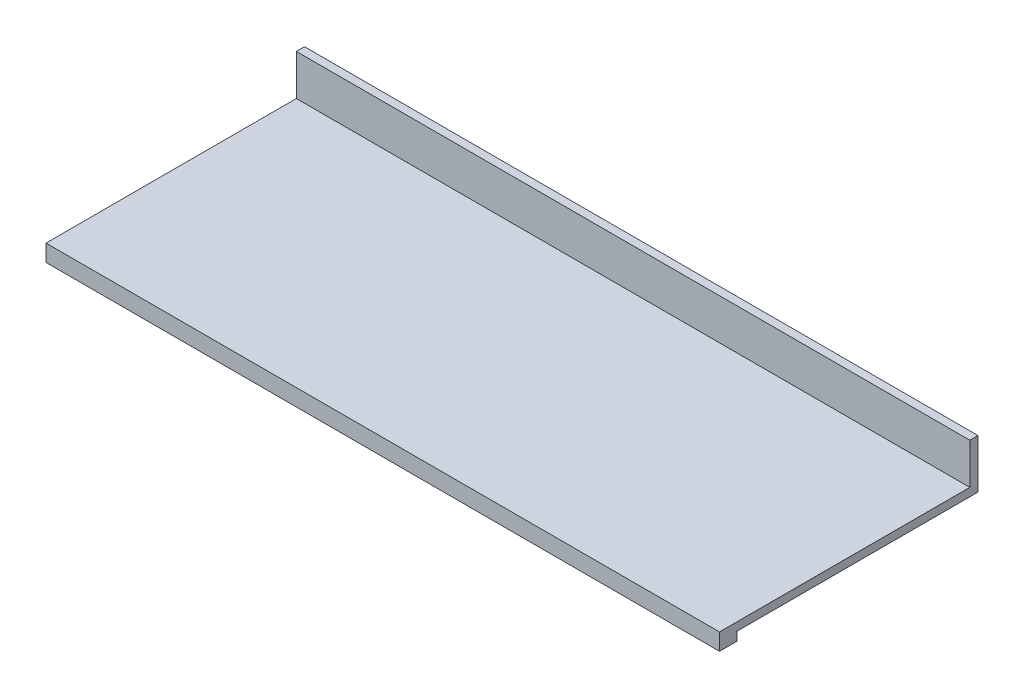
ISO-10303-21;
HEADER;
FILE_DESCRIPTION(('STEP AP214'),'2;1');
FILE_NAME('part.step','',(''),(''),'','','');
FILE_SCHEMA(('AUTOMOTIVE_DESIGN { 1 0 10303 214 1 1 1 1 }'));
ENDSEC;
DATA;
#1=APPLICATION_CONTEXT('core data for automotive mechanical design processes');
#2=APPLICATION_PROTOCOL_DEFINITION('international standard','automotive_design',2000,#1);
#3=PRODUCT_CONTEXT('',#1,'mechanical');
#4=PRODUCT('Part','Part','',(#3));
#5=PRODUCT_RELATED_PRODUCT_CATEGORY('part','',(#4));
#6=PRODUCT_DEFINITION_FORMATION('','',#4);
#7=PRODUCT_DEFINITION_CONTEXT('part definition',#1,'design');
#8=PRODUCT_DEFINITION('design','',#6,#7);
#9=PRODUCT_DEFINITION_SHAPE('','',#8);
#10=(LENGTH_UNIT() NAMED_UNIT(*) SI_UNIT(.MILLI.,.METRE.));
#11=(NAMED_UNIT(*) PLANE_ANGLE_UNIT() SI_UNIT($,.RADIAN.));
#12=(NAMED_UNIT(*) SI_UNIT($,.STERADIAN.) SOLID_ANGLE_UNIT());
#13=UNCERTAINTY_MEASURE_WITH_UNIT(LENGTH_MEASURE(1.E-05),#10,'distance_accuracy_value','');
#14=(GEOMETRIC_REPRESENTATION_CONTEXT(3) GLOBAL_UNCERTAINTY_ASSIGNED_CONTEXT((#13)) GLOBAL_UNIT_ASSIGNED_CONTEXT((#10,
#11,#12)) REPRESENTATION_CONTEXT('',''));
#15=CARTESIAN_POINT('',(0.,0.,0.));
#16=DIRECTION('',(0.,0.,1.));
#17=DIRECTION('',(1.,0.,0.));
#18=AXIS2_PLACEMENT_3D('',#15,#16,#17);
#19=CARTESIAN_POINT('',(0.,12.,0.));
#20=DIRECTION('',(0.,-1.,0.));
#21=DIRECTION('',(0.,0.,-1.));
#22=AXIS2_PLACEMENT_3D('',#19,#20,#21);
#23=PLANE('',#22);
#24=DIRECTION('',(1.,0.,0.));
#25=VECTOR('',#24,1.);
#26=CARTESIAN_POINT('',(495.,12.,-178.));
#27=LINE('',#26,#25);
#28=CARTESIAN_POINT('',(-495.,12.,-178.));
#29=VERTEX_POINT('',#28);
#30=CARTESIAN_POINT('',(495.,12.,-178.));
#31=VERTEX_POINT('',#30);
#32=EDGE_CURVE('E49',#29,#31,#27,.T.);
#33=ORIENTED_EDGE('',*,*,#32,.F.);
#34=DIRECTION('',(0.,0.,1.));
#35=VECTOR('',#34,1.);
#36=CARTESIAN_POINT('',(-495.,12.,190.));
#37=LINE('',#36,#35);
#38=CARTESIAN_POINT('',(-495.,12.,190.));
#39=VERTEX_POINT('',#38);
#40=EDGE_CURVE('E148',#29,#39,#37,.T.);
#41=ORIENTED_EDGE('',*,*,#40,.T.);
#42=DIRECTION('',(1.,0.,0.));
#43=VECTOR('',#42,1.);
#44=CARTESIAN_POINT('',(-495.,12.,190.));
#45=LINE('',#44,#43);
#46=CARTESIAN_POINT('',(495.,12.,190.));
#47=VERTEX_POINT('',#46);
#48=EDGE_CURVE('E151',#39,#47,#45,.T.);
#49=ORIENTED_EDGE('',*,*,#48,.T.);
#50=DIRECTION('',(0.,0.,-1.));
#51=VECTOR('',#50,1.);
#52=CARTESIAN_POINT('',(495.,12.,190.));
#53=LINE('',#52,#51);
#54=EDGE_CURVE('E146',#47,#31,#53,.T.);
#55=ORIENTED_EDGE('',*,*,#54,.T.);
#56=EDGE_LOOP('',(#33,#41,#49,#55));
#57=FACE_BOUND('',#56,.T.);
#58=ADVANCED_FACE('F34',(#57),#23,.F.);
#59=CARTESIAN_POINT('',(495.,12.,190.));
#60=DIRECTION('',(-1.,0.,0.));
#61=DIRECTION('',(0.,0.,1.));
#62=AXIS2_PLACEMENT_3D('',#59,#60,#61);
#63=PLANE('',#62);
#64=DIRECTION('',(0.,-1.,0.));
#65=VECTOR('',#64,1.);
#66=CARTESIAN_POINT('',(495.,12.,190.));
#67=LINE('',#66,#65);
#68=CARTESIAN_POINT('',(495.,-12.7,190.));
#69=VERTEX_POINT('',#68);
#70=EDGE_CURVE('E153',#47,#69,#67,.T.);
#71=ORIENTED_EDGE('',*,*,#70,.T.);
#72=DIRECTION('',(0.,0.,1.));
#73=VECTOR('',#72,1.);
#74=CARTESIAN_POINT('',(495.,-12.7,190.));
#75=LINE('',#74,#73);
#76=CARTESIAN_POINT('',(495.,-12.7,164.6));
#77=VERTEX_POINT('',#76);
#78=EDGE_CURVE('E134',#77,#69,#75,.T.);
#79=ORIENTED_EDGE('',*,*,#78,.F.);
#80=DIRECTION('',(0.,1.,0.));
#81=VECTOR('',#80,1.);
#82=CARTESIAN_POINT('',(495.,-12.7,164.6));
#83=LINE('',#82,#81);
#84=CARTESIAN_POINT('',(495.,0.,164.6));
#85=VERTEX_POINT('',#84);
#86=EDGE_CURVE('E140',#77,#85,#83,.T.);
#87=ORIENTED_EDGE('',*,*,#86,.T.);
#88=DIRECTION('',(0.,0.,-1.));
#89=VECTOR('',#88,1.);
#90=CARTESIAN_POINT('',(495.,0.,190.));
#91=LINE('',#90,#89);
#92=CARTESIAN_POINT('',(495.,0.,-190.));
#93=VERTEX_POINT('',#92);
#94=EDGE_CURVE('E104',#85,#93,#91,.T.);
#95=ORIENTED_EDGE('',*,*,#94,.T.);
#96=DIRECTION('',(0.,-1.,0.));
#97=VECTOR('',#96,1.);
#98=CARTESIAN_POINT('',(495.,12.,-190.));
#99=LINE('',#98,#97);
#100=CARTESIAN_POINT('',(495.,72.,-190.));
#101=VERTEX_POINT('',#100);
#102=EDGE_CURVE('E11',#101,#93,#99,.T.);
#103=ORIENTED_EDGE('',*,*,#102,.F.);
#104=DIRECTION('',(0.,0.,-1.));
#105=VECTOR('',#104,1.);
#106=CARTESIAN_POINT('',(495.,72.,-190.));
#107=LINE('',#106,#105);
#108=CARTESIAN_POINT('',(495.,72.,-178.));
#109=VERTEX_POINT('',#108);
#110=EDGE_CURVE('E102',#109,#101,#107,.T.);
#111=ORIENTED_EDGE('',*,*,#110,.F.);
#112=DIRECTION('',(0.,-1.,0.));
#113=VECTOR('',#112,1.);
#114=CARTESIAN_POINT('',(495.,72.,-178.));
#115=LINE('',#114,#113);
#116=EDGE_CURVE('E123',#109,#31,#115,.T.);
#117=ORIENTED_EDGE('',*,*,#116,.T.);
#118=ORIENTED_EDGE('',*,*,#54,.F.);
#119=EDGE_LOOP('',(#71,#79,#87,#95,#103,#111,#117,#118));
#120=FACE_BOUND('',#119,.T.);
#121=ADVANCED_FACE('F36',(#120),#63,.F.);
#122=CARTESIAN_POINT('',(-495.,12.,-190.));
#123=DIRECTION('',(0.,0.,1.));
#124=DIRECTION('',(1.,0.,0.));
#125=AXIS2_PLACEMENT_3D('',#122,#123,#124);
#126=PLANE('',#125);
#127=DIRECTION('',(-1.,0.,0.));
#128=VECTOR('',#127,1.);
#129=CARTESIAN_POINT('',(-495.,0.,-190.));
#130=LINE('',#129,#128);
#131=CARTESIAN_POINT('',(-495.,0.,-190.));
#132=VERTEX_POINT('',#131);
#133=EDGE_CURVE('E155',#93,#132,#130,.T.);
#134=ORIENTED_EDGE('',*,*,#133,.T.);
#135=DIRECTION('',(0.,-1.,0.));
#136=VECTOR('',#135,1.);
#137=CARTESIAN_POINT('',(-495.,12.,-190.));
#138=LINE('',#137,#136);
#139=CARTESIAN_POINT('',(-495.,72.,-190.));
#140=VERTEX_POINT('',#139);
#141=EDGE_CURVE('E42',#140,#132,#138,.T.);
#142=ORIENTED_EDGE('',*,*,#141,.F.);
#143=DIRECTION('',(-1.,0.,0.));
#144=VECTOR('',#143,1.);
#145=CARTESIAN_POINT('',(495.,72.,-190.));
#146=LINE('',#145,#144);
#147=EDGE_CURVE('E108',#101,#140,#146,.T.);
#148=ORIENTED_EDGE('',*,*,#147,.F.);
#149=ORIENTED_EDGE('',*,*,#102,.T.);
#150=EDGE_LOOP('',(#134,#142,#148,#149));
#151=FACE_BOUND('',#150,.T.);
#152=ADVANCED_FACE('F109',(#151),#126,.F.);
#153=CARTESIAN_POINT('',(-495.,12.,190.));
#154=DIRECTION('',(1.,0.,0.));
#155=DIRECTION('',(0.,0.,-1.));
#156=AXIS2_PLACEMENT_3D('',#153,#154,#155);
#157=PLANE('',#156);
#158=DIRECTION('',(0.,0.,1.));
#159=VECTOR('',#158,1.);
#160=CARTESIAN_POINT('',(-495.,0.,190.));
#161=LINE('',#160,#159);
#162=CARTESIAN_POINT('',(-495.,0.,164.6));
#163=VERTEX_POINT('',#162);
#164=EDGE_CURVE('E149',#132,#163,#161,.T.);
#165=ORIENTED_EDGE('',*,*,#164,.T.);
#166=DIRECTION('',(0.,1.,0.));
#167=VECTOR('',#166,1.);
#168=CARTESIAN_POINT('',(-495.,-12.7,164.6));
#169=LINE('',#168,#167);
#170=CARTESIAN_POINT('',(-495.,-12.7,164.6));
#171=VERTEX_POINT('',#170);
#172=EDGE_CURVE('E143',#171,#163,#169,.T.);
#173=ORIENTED_EDGE('',*,*,#172,.F.);
#174=DIRECTION('',(0.,0.,-1.));
#175=VECTOR('',#174,1.);
#176=CARTESIAN_POINT('',(-495.,-12.7,190.));
#177=LINE('',#176,#175);
#178=CARTESIAN_POINT('',(-495.,-12.7,190.));
#179=VERTEX_POINT('',#178);
#180=EDGE_CURVE('E129',#179,#171,#177,.T.);
#181=ORIENTED_EDGE('',*,*,#180,.F.);
#182=DIRECTION('',(0.,-1.,0.));
#183=VECTOR('',#182,1.);
#184=CARTESIAN_POINT('',(-495.,12.,190.));
#185=LINE('',#184,#183);
#186=EDGE_CURVE('E159',#39,#179,#185,.T.);
#187=ORIENTED_EDGE('',*,*,#186,.F.);
#188=ORIENTED_EDGE('',*,*,#40,.F.);
#189=DIRECTION('',(0.,-1.,0.));
#190=VECTOR('',#189,1.);
#191=CARTESIAN_POINT('',(-495.,72.,-178.));
#192=LINE('',#191,#190);
#193=CARTESIAN_POINT('',(-495.,72.,-178.));
#194=VERTEX_POINT('',#193);
#195=EDGE_CURVE('E126',#194,#29,#192,.T.);
#196=ORIENTED_EDGE('',*,*,#195,.F.);
#197=DIRECTION('',(0.,0.,1.));
#198=VECTOR('',#197,1.);
#199=CARTESIAN_POINT('',(-495.,72.,-190.));
#200=LINE('',#199,#198);
#201=EDGE_CURVE('E113',#140,#194,#200,.T.);
#202=ORIENTED_EDGE('',*,*,#201,.F.);
#203=ORIENTED_EDGE('',*,*,#141,.T.);
#204=EDGE_LOOP('',(#165,#173,#181,#187,#188,#196,#202,#203));
#205=FACE_BOUND('',#204,.T.);
#206=ADVANCED_FACE('F161',(#205),#157,.F.);
#207=CARTESIAN_POINT('',(-495.,12.,190.));
#208=DIRECTION('',(0.,0.,-1.));
#209=DIRECTION('',(-1.,0.,0.));
#210=AXIS2_PLACEMENT_3D('',#207,#208,#209);
#211=PLANE('',#210);
#212=ORIENTED_EDGE('',*,*,#186,.T.);
#213=DIRECTION('',(-1.,0.,0.));
#214=VECTOR('',#213,1.);
#215=CARTESIAN_POINT('',(-495.,-12.7,190.));
#216=LINE('',#215,#214);
#217=EDGE_CURVE('E137',#69,#179,#216,.T.);
#218=ORIENTED_EDGE('',*,*,#217,.F.);
#219=ORIENTED_EDGE('',*,*,#70,.F.);
#220=ORIENTED_EDGE('',*,*,#48,.F.);
#221=EDGE_LOOP('',(#212,#218,#219,#220));
#222=FACE_BOUND('',#221,.T.);
#223=ADVANCED_FACE('F176',(#222),#211,.F.);
#224=CARTESIAN_POINT('',(0.,0.,0.));
#225=DIRECTION('',(0.,-1.,0.));
#226=DIRECTION('',(0.,0.,-1.));
#227=AXIS2_PLACEMENT_3D('',#224,#225,#226);
#228=PLANE('',#227);
#229=DIRECTION('',(1.,0.,0.));
#230=VECTOR('',#229,1.);
#231=CARTESIAN_POINT('',(-495.,0.,164.6));
#232=LINE('',#231,#230);
#233=EDGE_CURVE('E57',#163,#85,#232,.T.);
#234=ORIENTED_EDGE('',*,*,#233,.F.);
#235=ORIENTED_EDGE('',*,*,#164,.F.);
#236=ORIENTED_EDGE('',*,*,#133,.F.);
#237=ORIENTED_EDGE('',*,*,#94,.F.);
#238=EDGE_LOOP('',(#234,#235,#236,#237));
#239=FACE_BOUND('',#238,.T.);
#240=ADVANCED_FACE('F164',(#239),#228,.T.);
#241=CARTESIAN_POINT('',(-495.,-12.7,164.6));
#242=DIRECTION('',(0.,0.,1.));
#243=DIRECTION('',(1.,0.,0.));
#244=AXIS2_PLACEMENT_3D('',#241,#242,#243);
#245=PLANE('',#244);
#246=ORIENTED_EDGE('',*,*,#233,.T.);
#247=ORIENTED_EDGE('',*,*,#86,.F.);
#248=DIRECTION('',(1.,0.,0.));
#249=VECTOR('',#248,1.);
#250=CARTESIAN_POINT('',(-495.,-12.7,164.6));
#251=LINE('',#250,#249);
#252=EDGE_CURVE('E132',#171,#77,#251,.T.);
#253=ORIENTED_EDGE('',*,*,#252,.F.);
#254=ORIENTED_EDGE('',*,*,#172,.T.);
#255=EDGE_LOOP('',(#246,#247,#253,#254));
#256=FACE_BOUND('',#255,.T.);
#257=ADVANCED_FACE('F167',(#256),#245,.F.);
#258=CARTESIAN_POINT('',(0.,-12.7,0.));
#259=DIRECTION('',(0.,-1.,0.));
#260=DIRECTION('',(0.,0.,-1.));
#261=AXIS2_PLACEMENT_3D('',#258,#259,#260);
#262=PLANE('',#261);
#263=ORIENTED_EDGE('',*,*,#180,.T.);
#264=ORIENTED_EDGE('',*,*,#252,.T.);
#265=ORIENTED_EDGE('',*,*,#78,.T.);
#266=ORIENTED_EDGE('',*,*,#217,.T.);
#267=EDGE_LOOP('',(#263,#264,#265,#266));
#268=FACE_BOUND('',#267,.T.);
#269=ADVANCED_FACE('F173',(#268),#262,.T.);
#270=CARTESIAN_POINT('',(495.,72.,-178.));
#271=DIRECTION('',(0.,0.,-1.));
#272=DIRECTION('',(-1.,0.,0.));
#273=AXIS2_PLACEMENT_3D('',#270,#271,#272);
#274=PLANE('',#273);
#275=ORIENTED_EDGE('',*,*,#32,.T.);
#276=ORIENTED_EDGE('',*,*,#116,.F.);
#277=DIRECTION('',(1.,0.,0.));
#278=VECTOR('',#277,1.);
#279=CARTESIAN_POINT('',(495.,72.,-178.));
#280=LINE('',#279,#278);
#281=EDGE_CURVE('E117',#194,#109,#280,.T.);
#282=ORIENTED_EDGE('',*,*,#281,.F.);
#283=ORIENTED_EDGE('',*,*,#195,.T.);
#284=EDGE_LOOP('',(#275,#276,#282,#283));
#285=FACE_BOUND('',#284,.T.);
#286=ADVANCED_FACE('F180',(#285),#274,.F.);
#287=CARTESIAN_POINT('',(0.,72.,0.));
#288=DIRECTION('',(0.,-1.,0.));
#289=DIRECTION('',(0.,0.,-1.));
#290=AXIS2_PLACEMENT_3D('',#287,#288,#289);
#291=PLANE('',#290);
#292=ORIENTED_EDGE('',*,*,#110,.T.);
#293=ORIENTED_EDGE('',*,*,#147,.T.);
#294=ORIENTED_EDGE('',*,*,#201,.T.);
#295=ORIENTED_EDGE('',*,*,#281,.T.);
#296=EDGE_LOOP('',(#292,#293,#294,#295));
#297=FACE_BOUND('',#296,.T.);
#298=ADVANCED_FACE('F115',(#297),#291,.F.);
#299=CLOSED_SHELL('',(#58,#121,#152,#206,#223,#240,#257,#269,#286,#298));
#300=MANIFOLD_SOLID_BREP('B2',#299);
#301=ADVANCED_BREP_SHAPE_REPRESENTATION('',(#18,#300),#14);
#302=SHAPE_DEFINITION_REPRESENTATION(#9,#301);
ENDSEC;
END-ISO-10303-21;
